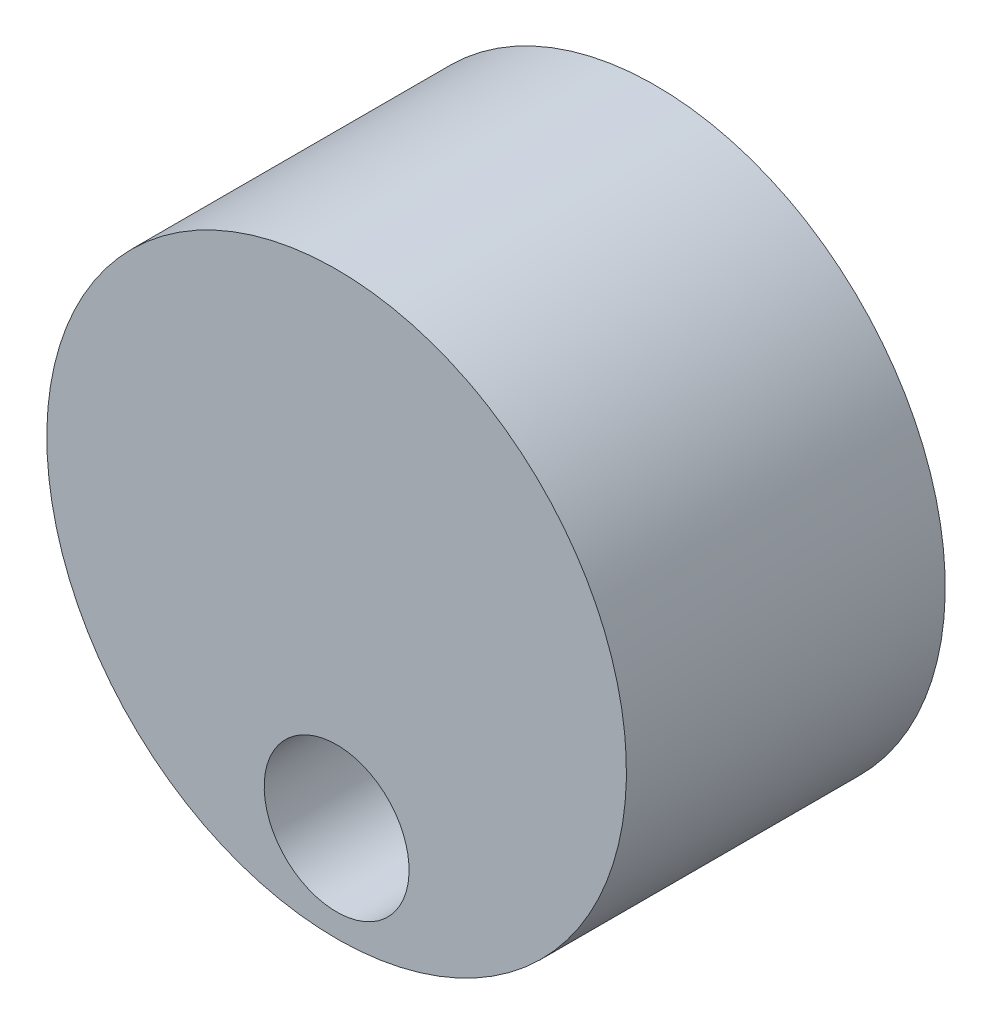
ISO-10303-21;
HEADER;
FILE_DESCRIPTION(('STEP AP214'),'2;1');
FILE_NAME('part.step','',(''),(''),'','','');
FILE_SCHEMA(('AUTOMOTIVE_DESIGN { 1 0 10303 214 1 1 1 1 }'));
ENDSEC;
DATA;
#1=APPLICATION_CONTEXT('core data for automotive mechanical design processes');
#2=APPLICATION_PROTOCOL_DEFINITION('international standard','automotive_design',2000,#1);
#3=PRODUCT_CONTEXT('',#1,'mechanical');
#4=PRODUCT('Part','Part','',(#3));
#5=PRODUCT_RELATED_PRODUCT_CATEGORY('part','',(#4));
#6=PRODUCT_DEFINITION_FORMATION('','',#4);
#7=PRODUCT_DEFINITION_CONTEXT('part definition',#1,'design');
#8=PRODUCT_DEFINITION('design','',#6,#7);
#9=PRODUCT_DEFINITION_SHAPE('','',#8);
#10=(LENGTH_UNIT() NAMED_UNIT(*) SI_UNIT(.MILLI.,.METRE.));
#11=(NAMED_UNIT(*) PLANE_ANGLE_UNIT() SI_UNIT($,.RADIAN.));
#12=(NAMED_UNIT(*) SI_UNIT($,.STERADIAN.) SOLID_ANGLE_UNIT());
#13=UNCERTAINTY_MEASURE_WITH_UNIT(LENGTH_MEASURE(1.E-05),#10,'distance_accuracy_value','');
#14=(GEOMETRIC_REPRESENTATION_CONTEXT(3) GLOBAL_UNCERTAINTY_ASSIGNED_CONTEXT((#13)) GLOBAL_UNIT_ASSIGNED_CONTEXT((#10,
#11,#12)) REPRESENTATION_CONTEXT('',''));
#15=CARTESIAN_POINT('',(0.,0.,0.));
#16=DIRECTION('',(0.,0.,1.));
#17=DIRECTION('',(1.,0.,0.));
#18=AXIS2_PLACEMENT_3D('',#15,#16,#17);
#19=CARTESIAN_POINT('',(0.,0.,13.97));
#20=DIRECTION('',(0.,0.,1.));
#21=DIRECTION('',(1.,0.,0.));
#22=AXIS2_PLACEMENT_3D('',#19,#20,#21);
#23=PLANE('',#22);
#24=CARTESIAN_POINT('',(0.,0.,13.97));
#25=DIRECTION('',(0.,0.,1.));
#26=DIRECTION('',(0.45338544026504,0.891314558702861,0.));
#27=AXIS2_PLACEMENT_3D('',#24,#25,#26);
#28=ELLIPSE('',#27,12.7,12.7);
#29=CARTESIAN_POINT('',(5.75799509136601,11.3196948955263,13.97));
#30=VERTEX_POINT('',#29);
#31=EDGE_CURVE('E10',#30,#30,#28,.T.);
#32=ORIENTED_EDGE('',*,*,#31,.T.);
#33=EDGE_LOOP('',(#32));
#34=FACE_BOUND('',#33,.T.);
#35=CARTESIAN_POINT('',(0.,-8.509,13.97));
#36=DIRECTION('',(0.,0.,1.));
#37=DIRECTION('',(-0.565173903661876,0.82497179262057,0.));
#38=AXIS2_PLACEMENT_3D('',#35,#36,#37);
#39=ELLIPSE('',#38,3.175,3.175);
#40=CARTESIAN_POINT('',(-1.79442714412646,-5.88971455842969,13.97));
#41=VERTEX_POINT('',#40);
#42=EDGE_CURVE('E42',#41,#41,#39,.T.);
#43=ORIENTED_EDGE('',*,*,#42,.F.);
#44=EDGE_LOOP('',(#43));
#45=FACE_BOUND('',#44,.T.);
#46=ADVANCED_FACE('F31',(#34,#45),#23,.T.);
#47=CARTESIAN_POINT('',(0.,0.,0.));
#48=DIRECTION('',(0.,0.,1.));
#49=DIRECTION('',(1.,0.,0.));
#50=AXIS2_PLACEMENT_3D('',#47,#48,#49);
#51=PLANE('',#50);
#52=CARTESIAN_POINT('',(0.,0.,0.));
#53=DIRECTION('',(0.,0.,1.));
#54=DIRECTION('',(0.45338544026504,0.891314558702861,0.));
#55=AXIS2_PLACEMENT_3D('',#52,#53,#54);
#56=ELLIPSE('',#55,12.7,12.7);
#57=CARTESIAN_POINT('',(5.75799509136601,11.3196948955263,0.));
#58=VERTEX_POINT('',#57);
#59=EDGE_CURVE('E36',#58,#58,#56,.T.);
#60=ORIENTED_EDGE('',*,*,#59,.F.);
#61=EDGE_LOOP('',(#60));
#62=FACE_BOUND('',#61,.T.);
#63=CARTESIAN_POINT('',(0.,-8.509,0.));
#64=DIRECTION('',(0.,0.,1.));
#65=DIRECTION('',(-0.565173903661876,0.82497179262057,0.));
#66=AXIS2_PLACEMENT_3D('',#63,#64,#65);
#67=ELLIPSE('',#66,3.175,3.175);
#68=CARTESIAN_POINT('',(-1.79442714412646,-5.88971455842969,0.));
#69=VERTEX_POINT('',#68);
#70=EDGE_CURVE('E45',#69,#69,#67,.T.);
#71=ORIENTED_EDGE('',*,*,#70,.T.);
#72=EDGE_LOOP('',(#71));
#73=FACE_BOUND('',#72,.T.);
#74=ADVANCED_FACE('F56',(#62,#73),#51,.F.);
#75=DIRECTION('',(0.,0.,-1.));
#76=VECTOR('',#75,1.);
#77=SURFACE_OF_LINEAR_EXTRUSION('',#28,#76);
#78=ORIENTED_EDGE('',*,*,#31,.F.);
#79=EDGE_LOOP('',(#78));
#80=FACE_BOUND('',#79,.T.);
#81=ORIENTED_EDGE('',*,*,#59,.T.);
#82=EDGE_LOOP('',(#81));
#83=FACE_BOUND('',#82,.T.);
#84=ADVANCED_FACE('F33',(#80,#83),#77,.F.);
#85=DIRECTION('',(0.,0.,-1.));
#86=VECTOR('',#85,1.);
#87=SURFACE_OF_LINEAR_EXTRUSION('',#39,#86);
#88=ORIENTED_EDGE('',*,*,#42,.T.);
#89=EDGE_LOOP('',(#88));
#90=FACE_BOUND('',#89,.T.);
#91=ORIENTED_EDGE('',*,*,#70,.F.);
#92=EDGE_LOOP('',(#91));
#93=FACE_BOUND('',#92,.T.);
#94=ADVANCED_FACE('F51',(#90,#93),#87,.T.);
#95=CLOSED_SHELL('',(#46,#74,#84,#94));
#96=MANIFOLD_SOLID_BREP('B2',#95);
#97=ADVANCED_BREP_SHAPE_REPRESENTATION('',(#18,#96),#14);
#98=SHAPE_DEFINITION_REPRESENTATION(#9,#97);
ENDSEC;
END-ISO-10303-21;
